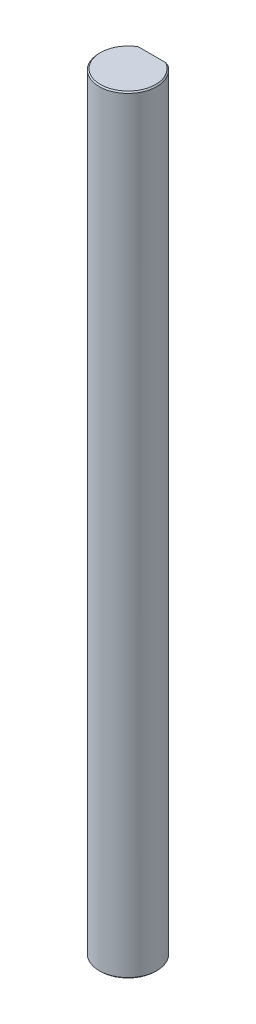
ISO-10303-21;
HEADER;
FILE_DESCRIPTION(('STEP AP214'),'2;1');
FILE_NAME('part.step','',(''),(''),'','','');
FILE_SCHEMA(('AUTOMOTIVE_DESIGN { 1 0 10303 214 1 1 1 1 }'));
ENDSEC;
DATA;
#1=APPLICATION_CONTEXT('core data for automotive mechanical design processes');
#2=APPLICATION_PROTOCOL_DEFINITION('international standard','automotive_design',2000,#1);
#3=PRODUCT_CONTEXT('',#1,'mechanical');
#4=PRODUCT('Part','Part','',(#3));
#5=PRODUCT_RELATED_PRODUCT_CATEGORY('part','',(#4));
#6=PRODUCT_DEFINITION_FORMATION('','',#4);
#7=PRODUCT_DEFINITION_CONTEXT('part definition',#1,'design');
#8=PRODUCT_DEFINITION('design','',#6,#7);
#9=PRODUCT_DEFINITION_SHAPE('','',#8);
#10=(LENGTH_UNIT() NAMED_UNIT(*) SI_UNIT(.MILLI.,.METRE.));
#11=(NAMED_UNIT(*) PLANE_ANGLE_UNIT() SI_UNIT($,.RADIAN.));
#12=(NAMED_UNIT(*) SI_UNIT($,.STERADIAN.) SOLID_ANGLE_UNIT());
#13=UNCERTAINTY_MEASURE_WITH_UNIT(LENGTH_MEASURE(1.E-05),#10,'distance_accuracy_value','');
#14=(GEOMETRIC_REPRESENTATION_CONTEXT(3) GLOBAL_UNCERTAINTY_ASSIGNED_CONTEXT((#13)) GLOBAL_UNIT_ASSIGNED_CONTEXT((#10,
#11,#12)) REPRESENTATION_CONTEXT('',''));
#15=CARTESIAN_POINT('',(0.,0.,0.));
#16=DIRECTION('',(0.,0.,1.));
#17=DIRECTION('',(1.,0.,0.));
#18=AXIS2_PLACEMENT_3D('',#15,#16,#17);
#19=CARTESIAN_POINT('',(0.,80.,0.));
#20=DIRECTION('',(0.,-1.,0.));
#21=DIRECTION('',(0.,0.,-1.));
#22=AXIS2_PLACEMENT_3D('',#19,#20,#21);
#23=CONICAL_SURFACE('',#22,2.875,0.785398163397412);
#24=CARTESIAN_POINT('',(-1.6583123951777,79.875,-2.5));
#25=CARTESIAN_POINT('',(-1.57973572193476,79.9184348904035,-2.5));
#26=CARTESIAN_POINT('',(-1.50022900034241,79.9602466964647,-2.5));
#27=CARTESIAN_POINT('',(-1.41972708645009,80.,-2.5));
#28=(BOUNDED_CURVE() B_SPLINE_CURVE(3,(#24,#25,#26,#27),.UNSPECIFIED.,.F.,
.F.) B_SPLINE_CURVE_WITH_KNOTS((4,4),(0.,0.000269347265701084),
.UNSPECIFIED.) CURVE() GEOMETRIC_REPRESENTATION_ITEM() RATIONAL_B_SPLINE_CURVE((1.,1.,1.,1.)) REPRESENTATION_ITEM(''));
#29=CARTESIAN_POINT('',(-1.6583123951777,79.875,-2.5));
#30=VERTEX_POINT('',#29);
#31=CARTESIAN_POINT('',(-1.41972708645009,80.,-2.5));
#32=VERTEX_POINT('',#31);
#33=EDGE_CURVE('E128',#30,#32,#28,.T.);
#34=ORIENTED_EDGE('',*,*,#33,.F.);
#35=CARTESIAN_POINT('',(0.,79.875,0.));
#36=DIRECTION('',(0.,-1.,0.));
#37=DIRECTION('',(0.,0.,1.));
#38=AXIS2_PLACEMENT_3D('',#35,#36,#37);
#39=CIRCLE('',#38,3.);
#40=CARTESIAN_POINT('',(1.6583123951777,79.875,-2.5));
#41=VERTEX_POINT('',#40);
#42=EDGE_CURVE('E121',#41,#30,#39,.T.);
#43=ORIENTED_EDGE('',*,*,#42,.F.);
#44=CARTESIAN_POINT('',(1.41972708645009,80.,-2.5));
#45=CARTESIAN_POINT('',(1.5002290003424,79.9602466964647,-2.5));
#46=CARTESIAN_POINT('',(1.57973572193477,79.9184348904035,-2.5));
#47=CARTESIAN_POINT('',(1.6583123951777,79.875,-2.5));
#48=(BOUNDED_CURVE() B_SPLINE_CURVE(3,(#44,#45,#46,#47),.UNSPECIFIED.,.F.,
.F.) B_SPLINE_CURVE_WITH_KNOTS((4,4),(0.,0.000269347265701083),
.UNSPECIFIED.) CURVE() GEOMETRIC_REPRESENTATION_ITEM() RATIONAL_B_SPLINE_CURVE((1.,1.,1.,1.)) REPRESENTATION_ITEM(''));
#49=CARTESIAN_POINT('',(1.41972708645009,80.,-2.5));
#50=VERTEX_POINT('',#49);
#51=EDGE_CURVE('E20',#50,#41,#48,.T.);
#52=ORIENTED_EDGE('',*,*,#51,.F.);
#53=CARTESIAN_POINT('',(0.,80.,0.));
#54=DIRECTION('',(0.,1.,0.));
#55=DIRECTION('',(0.,0.,1.));
#56=AXIS2_PLACEMENT_3D('',#53,#54,#55);
#57=CIRCLE('',#56,2.875);
#58=EDGE_CURVE('E28',#32,#50,#57,.T.);
#59=ORIENTED_EDGE('',*,*,#58,.F.);
#60=EDGE_LOOP('',(#34,#43,#52,#59));
#61=FACE_BOUND('',#60,.T.);
#62=ADVANCED_FACE('F16',(#61),#23,.T.);
#63=CARTESIAN_POINT('',(0.,0.125000000000014,0.));
#64=DIRECTION('',(0.,1.,0.));
#65=DIRECTION('',(0.,0.,1.));
#66=AXIS2_PLACEMENT_3D('',#63,#64,#65);
#67=CONICAL_SURFACE('',#66,3.,0.785398163397438);
#68=DIRECTION('',(0.,0.707106781186555,0.70710678118654));
#69=VECTOR('',#68,1.);
#70=CARTESIAN_POINT('',(0.,0.125000000000014,3.));
#71=LINE('',#70,#69);
#72=CARTESIAN_POINT('',(0.,0.,2.875));
#73=VERTEX_POINT('',#72);
#74=CARTESIAN_POINT('',(0.,0.125000000000014,3.));
#75=VERTEX_POINT('',#74);
#76=EDGE_CURVE('E99',#73,#75,#71,.T.);
#77=ORIENTED_EDGE('',*,*,#76,.F.);
#78=CARTESIAN_POINT('',(0.,0.,0.));
#79=DIRECTION('',(0.,-1.,0.));
#80=DIRECTION('',(0.,0.,1.));
#81=AXIS2_PLACEMENT_3D('',#78,#79,#80);
#82=CIRCLE('',#81,2.875);
#83=CARTESIAN_POINT('',(1.41972708645005,0.,-2.5));
#84=VERTEX_POINT('',#83);
#85=EDGE_CURVE('E10',#84,#73,#82,.T.);
#86=ORIENTED_EDGE('',*,*,#85,.F.);
#87=CARTESIAN_POINT('',(1.6583123951777,0.125000000000014,-2.5));
#88=CARTESIAN_POINT('',(1.57973572193475,0.0815651095964749,-2.5));
#89=CARTESIAN_POINT('',(1.50022900034238,0.039753303535281,-2.5));
#90=CARTESIAN_POINT('',(1.41972708645005,0.,-2.5));
#91=(BOUNDED_CURVE() B_SPLINE_CURVE(3,(#87,#88,#89,#90),.UNSPECIFIED.,.F.,
.F.) B_SPLINE_CURVE_WITH_KNOTS((4,4),(0.,0.000269347265701127),
.UNSPECIFIED.) CURVE() GEOMETRIC_REPRESENTATION_ITEM() RATIONAL_B_SPLINE_CURVE((1.,1.,1.,1.)) REPRESENTATION_ITEM(''));
#92=CARTESIAN_POINT('',(1.6583123951777,0.125000000000014,-2.5));
#93=VERTEX_POINT('',#92);
#94=EDGE_CURVE('E76',#93,#84,#91,.T.);
#95=ORIENTED_EDGE('',*,*,#94,.F.);
#96=CARTESIAN_POINT('',(0.,0.125000000000014,0.));
#97=DIRECTION('',(0.,1.,0.));
#98=DIRECTION('',(0.,0.,1.));
#99=AXIS2_PLACEMENT_3D('',#96,#97,#98);
#100=CIRCLE('',#99,3.);
#101=EDGE_CURVE('E102',#75,#93,#100,.T.);
#102=ORIENTED_EDGE('',*,*,#101,.F.);
#103=EDGE_LOOP('',(#77,#86,#95,#102));
#104=FACE_BOUND('',#103,.T.);
#105=ADVANCED_FACE('F100',(#104),#67,.T.);
#106=CARTESIAN_POINT('',(0.,0.,0.));
#107=DIRECTION('',(0.,1.,0.));
#108=DIRECTION('',(1.,0.,0.));
#109=AXIS2_PLACEMENT_3D('',#106,#107,#108);
#110=PLANE('',#109);
#111=DIRECTION('',(1.,0.,0.));
#112=VECTOR('',#111,1.);
#113=CARTESIAN_POINT('',(0.,0.,-2.5));
#114=LINE('',#113,#112);
#115=CARTESIAN_POINT('',(-1.41972708645005,0.,-2.5));
#116=VERTEX_POINT('',#115);
#117=EDGE_CURVE('E97',#116,#84,#114,.T.);
#118=ORIENTED_EDGE('',*,*,#117,.T.);
#119=ORIENTED_EDGE('',*,*,#85,.T.);
#120=CARTESIAN_POINT('',(0.,0.,0.));
#121=DIRECTION('',(0.,-1.,0.));
#122=DIRECTION('',(0.,0.,1.));
#123=AXIS2_PLACEMENT_3D('',#120,#121,#122);
#124=CIRCLE('',#123,2.875);
#125=EDGE_CURVE('E96',#73,#116,#124,.T.);
#126=ORIENTED_EDGE('',*,*,#125,.T.);
#127=EDGE_LOOP('',(#118,#119,#126));
#128=FACE_BOUND('',#127,.T.);
#129=ADVANCED_FACE('F94',(#128),#110,.F.);
#130=CARTESIAN_POINT('',(0.,80.,0.));
#131=DIRECTION('',(0.,1.,0.));
#132=DIRECTION('',(1.,0.,0.));
#133=AXIS2_PLACEMENT_3D('',#130,#131,#132);
#134=PLANE('',#133);
#135=DIRECTION('',(1.,0.,0.));
#136=VECTOR('',#135,1.);
#137=CARTESIAN_POINT('',(0.,80.,-2.5));
#138=LINE('',#137,#136);
#139=EDGE_CURVE('E125',#32,#50,#138,.T.);
#140=ORIENTED_EDGE('',*,*,#139,.F.);
#141=ORIENTED_EDGE('',*,*,#58,.T.);
#142=EDGE_LOOP('',(#140,#141));
#143=FACE_BOUND('',#142,.T.);
#144=ADVANCED_FACE('F178',(#143),#134,.T.);
#145=CARTESIAN_POINT('',(0.,80.,-2.5));
#146=DIRECTION('',(0.,0.,-1.));
#147=DIRECTION('',(0.,-1.,0.));
#148=AXIS2_PLACEMENT_3D('',#145,#146,#147);
#149=PLANE('',#148);
#150=DIRECTION('',(0.,-1.,0.));
#151=VECTOR('',#150,1.);
#152=CARTESIAN_POINT('',(1.6583123951777,80.,-2.5));
#153=LINE('',#152,#151);
#154=EDGE_CURVE('E124',#41,#93,#153,.T.);
#155=ORIENTED_EDGE('',*,*,#154,.T.);
#156=ORIENTED_EDGE('',*,*,#94,.T.);
#157=ORIENTED_EDGE('',*,*,#117,.F.);
#158=CARTESIAN_POINT('',(-1.41972708645005,0.,-2.5));
#159=CARTESIAN_POINT('',(-1.50022900034237,0.0397533035353052,-2.5));
#160=CARTESIAN_POINT('',(-1.57973572193476,0.0815651095964627,-2.5));
#161=CARTESIAN_POINT('',(-1.6583123951777,0.125000000000014,-2.5));
#162=(BOUNDED_CURVE() B_SPLINE_CURVE(3,(#158,#159,#160,#161),.UNSPECIFIED.,.F.,
.F.) B_SPLINE_CURVE_WITH_KNOTS((4,4),(0.,0.000269347265701127),
.UNSPECIFIED.) CURVE() GEOMETRIC_REPRESENTATION_ITEM() RATIONAL_B_SPLINE_CURVE((1.,1.,1.,1.)) REPRESENTATION_ITEM(''));
#163=CARTESIAN_POINT('',(-1.6583123951777,0.125000000000014,-2.5));
#164=VERTEX_POINT('',#163);
#165=EDGE_CURVE('E111',#116,#164,#162,.T.);
#166=ORIENTED_EDGE('',*,*,#165,.T.);
#167=DIRECTION('',(0.,-1.,0.));
#168=VECTOR('',#167,1.);
#169=CARTESIAN_POINT('',(-1.6583123951777,80.,-2.5));
#170=LINE('',#169,#168);
#171=EDGE_CURVE('E135',#30,#164,#170,.T.);
#172=ORIENTED_EDGE('',*,*,#171,.F.);
#173=ORIENTED_EDGE('',*,*,#33,.T.);
#174=ORIENTED_EDGE('',*,*,#139,.T.);
#175=ORIENTED_EDGE('',*,*,#51,.T.);
#176=EDGE_LOOP('',(#155,#156,#157,#166,#172,#173,#174,#175));
#177=FACE_BOUND('',#176,.T.);
#178=ADVANCED_FACE('F18',(#177),#149,.T.);
#179=CARTESIAN_POINT('',(0.,80.,0.));
#180=DIRECTION('',(0.,-1.,0.));
#181=DIRECTION('',(0.,0.,-1.));
#182=AXIS2_PLACEMENT_3D('',#179,#180,#181);
#183=CYLINDRICAL_SURFACE('',#182,3.);
#184=ORIENTED_EDGE('',*,*,#171,.T.);
#185=CARTESIAN_POINT('',(0.,0.125000000000014,0.));
#186=DIRECTION('',(0.,1.,0.));
#187=DIRECTION('',(0.,0.,1.));
#188=AXIS2_PLACEMENT_3D('',#185,#186,#187);
#189=CIRCLE('',#188,3.);
#190=EDGE_CURVE('E107',#164,#75,#189,.T.);
#191=ORIENTED_EDGE('',*,*,#190,.T.);
#192=ORIENTED_EDGE('',*,*,#101,.T.);
#193=ORIENTED_EDGE('',*,*,#154,.F.);
#194=ORIENTED_EDGE('',*,*,#42,.T.);
#195=EDGE_LOOP('',(#184,#191,#192,#193,#194));
#196=FACE_BOUND('',#195,.T.);
#197=ADVANCED_FACE('F175',(#196),#183,.T.);
#198=CARTESIAN_POINT('',(0.,0.125000000000014,0.));
#199=DIRECTION('',(0.,1.,0.));
#200=DIRECTION('',(0.,0.,1.));
#201=AXIS2_PLACEMENT_3D('',#198,#199,#200);
#202=CONICAL_SURFACE('',#201,3.,0.785398163397438);
#203=ORIENTED_EDGE('',*,*,#125,.F.);
#204=ORIENTED_EDGE('',*,*,#76,.T.);
#205=ORIENTED_EDGE('',*,*,#190,.F.);
#206=ORIENTED_EDGE('',*,*,#165,.F.);
#207=EDGE_LOOP('',(#203,#204,#205,#206));
#208=FACE_BOUND('',#207,.T.);
#209=ADVANCED_FACE('F109',(#208),#202,.T.);
#210=CLOSED_SHELL('',(#62,#105,#129,#144,#178,#197,#209));
#211=MANIFOLD_SOLID_BREP('B1',#210);
#212=ADVANCED_BREP_SHAPE_REPRESENTATION('',(#18,#211),#14);
#213=SHAPE_DEFINITION_REPRESENTATION(#9,#212);
ENDSEC;
END-ISO-10303-21;
